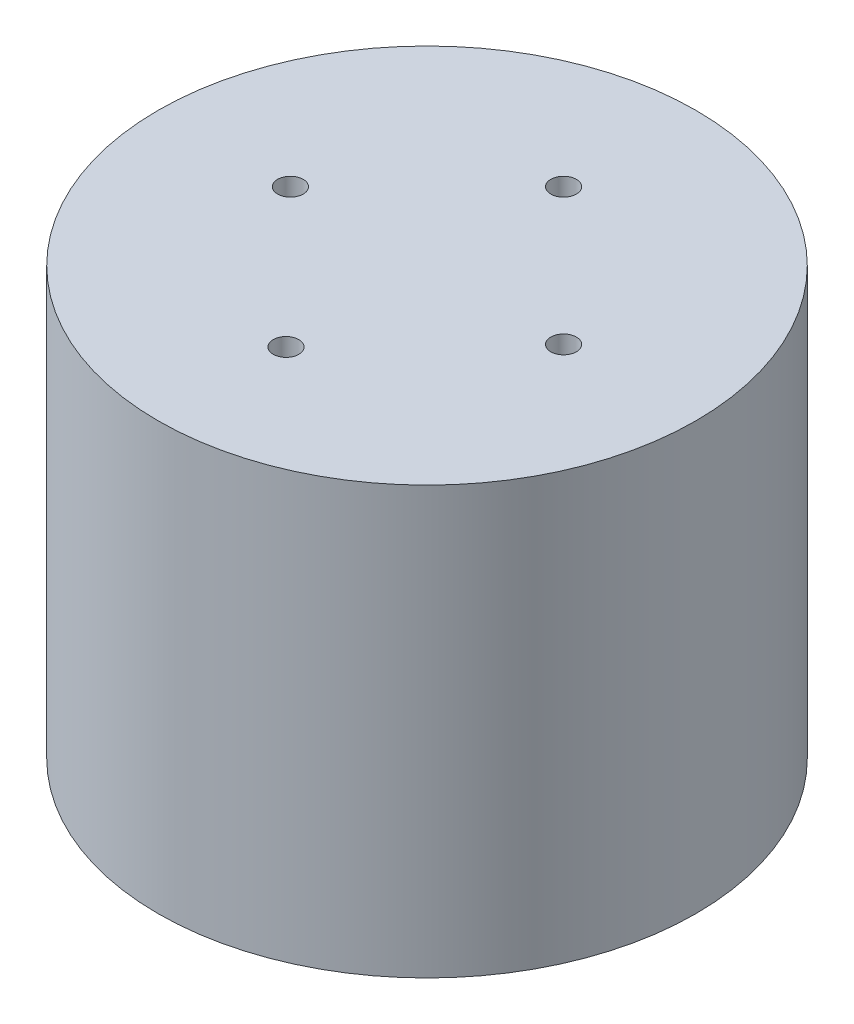
ISO-10303-21;
HEADER;
FILE_DESCRIPTION(('STEP AP214'),'2;1');
FILE_NAME('part.step','',(''),(''),'','','');
FILE_SCHEMA(('AUTOMOTIVE_DESIGN { 1 0 10303 214 1 1 1 1 }'));
ENDSEC;
DATA;
#1=APPLICATION_CONTEXT('core data for automotive mechanical design processes');
#2=APPLICATION_PROTOCOL_DEFINITION('international standard','automotive_design',2000,#1);
#3=PRODUCT_CONTEXT('',#1,'mechanical');
#4=PRODUCT('Part','Part','',(#3));
#5=PRODUCT_RELATED_PRODUCT_CATEGORY('part','',(#4));
#6=PRODUCT_DEFINITION_FORMATION('','',#4);
#7=PRODUCT_DEFINITION_CONTEXT('part definition',#1,'design');
#8=PRODUCT_DEFINITION('design','',#6,#7);
#9=PRODUCT_DEFINITION_SHAPE('','',#8);
#10=(LENGTH_UNIT() NAMED_UNIT(*) SI_UNIT(.MILLI.,.METRE.));
#11=(NAMED_UNIT(*) PLANE_ANGLE_UNIT() SI_UNIT($,.RADIAN.));
#12=(NAMED_UNIT(*) SI_UNIT($,.STERADIAN.) SOLID_ANGLE_UNIT());
#13=UNCERTAINTY_MEASURE_WITH_UNIT(LENGTH_MEASURE(1.E-05),#10,'distance_accuracy_value','');
#14=(GEOMETRIC_REPRESENTATION_CONTEXT(3) GLOBAL_UNCERTAINTY_ASSIGNED_CONTEXT((#13)) GLOBAL_UNIT_ASSIGNED_CONTEXT((#10,
#11,#12)) REPRESENTATION_CONTEXT('',''));
#15=CARTESIAN_POINT('',(0.,0.,0.));
#16=DIRECTION('',(0.,0.,1.));
#17=DIRECTION('',(1.,0.,0.));
#18=AXIS2_PLACEMENT_3D('',#15,#16,#17);
#19=CARTESIAN_POINT('',(0.,50.,0.));
#20=DIRECTION('',(0.,-1.,0.));
#21=DIRECTION('',(0.,0.,-1.));
#22=AXIS2_PLACEMENT_3D('',#19,#20,#21);
#23=CYLINDRICAL_SURFACE('',#22,31.5);
#24=CARTESIAN_POINT('',(0.,50.,0.));
#25=DIRECTION('',(0.,1.,0.));
#26=DIRECTION('',(0.,0.,1.));
#27=AXIS2_PLACEMENT_3D('',#24,#25,#26);
#28=CIRCLE('',#27,31.5);
#29=CARTESIAN_POINT('',(0.,50.,31.5));
#30=VERTEX_POINT('',#29);
#31=EDGE_CURVE('E10',#30,#30,#28,.T.);
#32=ORIENTED_EDGE('',*,*,#31,.F.);
#33=EDGE_LOOP('',(#32));
#34=FACE_BOUND('',#33,.T.);
#35=CARTESIAN_POINT('',(0.,0.,0.));
#36=DIRECTION('',(0.,1.,0.));
#37=DIRECTION('',(0.,0.,1.));
#38=AXIS2_PLACEMENT_3D('',#35,#36,#37);
#39=CIRCLE('',#38,31.5);
#40=CARTESIAN_POINT('',(0.,0.,31.5));
#41=VERTEX_POINT('',#40);
#42=EDGE_CURVE('E42',#41,#41,#39,.T.);
#43=ORIENTED_EDGE('',*,*,#42,.T.);
#44=EDGE_LOOP('',(#43));
#45=FACE_BOUND('',#44,.T.);
#46=ADVANCED_FACE('F35',(#34,#45),#23,.T.);
#47=CARTESIAN_POINT('',(0.,50.,0.));
#48=DIRECTION('',(0.,1.,0.));
#49=DIRECTION('',(0.,0.,1.));
#50=AXIS2_PLACEMENT_3D('',#47,#48,#49);
#51=PLANE('',#50);
#52=CARTESIAN_POINT('',(0.,50.,-16.));
#53=DIRECTION('',(0.,1.,0.));
#54=DIRECTION('',(0.,0.,1.));
#55=AXIS2_PLACEMENT_3D('',#52,#53,#54);
#56=CIRCLE('',#55,1.5);
#57=CARTESIAN_POINT('',(0.,50.,-14.5));
#58=VERTEX_POINT('',#57);
#59=EDGE_CURVE('E61',#58,#58,#56,.T.);
#60=ORIENTED_EDGE('',*,*,#59,.F.);
#61=EDGE_LOOP('',(#60));
#62=FACE_BOUND('',#61,.T.);
#63=CARTESIAN_POINT('',(16.,50.,0.));
#64=DIRECTION('',(0.,1.,0.));
#65=DIRECTION('',(0.,0.,1.));
#66=AXIS2_PLACEMENT_3D('',#63,#64,#65);
#67=CIRCLE('',#66,1.5);
#68=CARTESIAN_POINT('',(16.,50.,1.5));
#69=VERTEX_POINT('',#68);
#70=EDGE_CURVE('E152',#69,#69,#67,.T.);
#71=ORIENTED_EDGE('',*,*,#70,.F.);
#72=EDGE_LOOP('',(#71));
#73=FACE_BOUND('',#72,.T.);
#74=CARTESIAN_POINT('',(0.,50.,16.513466974242));
#75=DIRECTION('',(0.,1.,0.));
#76=DIRECTION('',(0.,0.,1.));
#77=AXIS2_PLACEMENT_3D('',#74,#75,#76);
#78=CIRCLE('',#77,1.5);
#79=CARTESIAN_POINT('',(0.,50.,18.013466974242));
#80=VERTEX_POINT('',#79);
#81=EDGE_CURVE('E74',#80,#80,#78,.T.);
#82=ORIENTED_EDGE('',*,*,#81,.F.);
#83=EDGE_LOOP('',(#82));
#84=FACE_BOUND('',#83,.T.);
#85=CARTESIAN_POINT('',(-16.,50.,0.));
#86=DIRECTION('',(0.,1.,0.));
#87=DIRECTION('',(0.,0.,1.));
#88=AXIS2_PLACEMENT_3D('',#85,#86,#87);
#89=CIRCLE('',#88,1.5);
#90=CARTESIAN_POINT('',(-16.,50.,1.5));
#91=VERTEX_POINT('',#90);
#92=EDGE_CURVE('E57',#91,#91,#89,.T.);
#93=ORIENTED_EDGE('',*,*,#92,.F.);
#94=EDGE_LOOP('',(#93));
#95=FACE_BOUND('',#94,.T.);
#96=ORIENTED_EDGE('',*,*,#31,.T.);
#97=EDGE_LOOP('',(#96));
#98=FACE_BOUND('',#97,.T.);
#99=ADVANCED_FACE('F97',(#62,#73,#84,#95,#98),#51,.T.);
#100=CARTESIAN_POINT('',(0.,0.,0.));
#101=DIRECTION('',(0.,1.,0.));
#102=DIRECTION('',(0.,0.,1.));
#103=AXIS2_PLACEMENT_3D('',#100,#101,#102);
#104=PLANE('',#103);
#105=CARTESIAN_POINT('',(0.,0.,0.));
#106=DIRECTION('',(0.,-1.,0.));
#107=DIRECTION('',(0.,0.,-1.));
#108=AXIS2_PLACEMENT_3D('',#105,#106,#107);
#109=CIRCLE('',#108,26.);
#110=CARTESIAN_POINT('',(0.,0.,-26.));
#111=VERTEX_POINT('',#110);
#112=EDGE_CURVE('E50',#111,#111,#109,.T.);
#113=ORIENTED_EDGE('',*,*,#112,.F.);
#114=EDGE_LOOP('',(#113));
#115=FACE_BOUND('',#114,.T.);
#116=ORIENTED_EDGE('',*,*,#42,.F.);
#117=EDGE_LOOP('',(#116));
#118=FACE_BOUND('',#117,.T.);
#119=ADVANCED_FACE('F94',(#115,#118),#104,.F.);
#120=CARTESIAN_POINT('',(0.,20.,0.));
#121=DIRECTION('',(0.,-1.,0.));
#122=DIRECTION('',(0.,0.,-1.));
#123=AXIS2_PLACEMENT_3D('',#120,#121,#122);
#124=CYLINDRICAL_SURFACE('',#123,26.);
#125=CARTESIAN_POINT('',(0.,20.,0.));
#126=DIRECTION('',(0.,-1.,0.));
#127=DIRECTION('',(0.,0.,-1.));
#128=AXIS2_PLACEMENT_3D('',#125,#126,#127);
#129=CIRCLE('',#128,26.);
#130=CARTESIAN_POINT('',(0.,20.,-26.));
#131=VERTEX_POINT('',#130);
#132=EDGE_CURVE('E47',#131,#131,#129,.T.);
#133=ORIENTED_EDGE('',*,*,#132,.F.);
#134=EDGE_LOOP('',(#133));
#135=FACE_BOUND('',#134,.T.);
#136=ORIENTED_EDGE('',*,*,#112,.T.);
#137=EDGE_LOOP('',(#136));
#138=FACE_BOUND('',#137,.T.);
#139=ADVANCED_FACE('F92',(#135,#138),#124,.F.);
#140=CARTESIAN_POINT('',(0.,20.,0.));
#141=DIRECTION('',(0.,-1.,0.));
#142=DIRECTION('',(0.,0.,-1.));
#143=AXIS2_PLACEMENT_3D('',#140,#141,#142);
#144=PLANE('',#143);
#145=CARTESIAN_POINT('',(0.,20.,-16.));
#146=DIRECTION('',(0.,-1.,0.));
#147=DIRECTION('',(0.,0.,-1.));
#148=AXIS2_PLACEMENT_3D('',#145,#146,#147);
#149=CIRCLE('',#148,1.5);
#150=CARTESIAN_POINT('',(0.,20.,-17.5));
#151=VERTEX_POINT('',#150);
#152=EDGE_CURVE('E38',#151,#151,#149,.T.);
#153=ORIENTED_EDGE('',*,*,#152,.F.);
#154=EDGE_LOOP('',(#153));
#155=FACE_BOUND('',#154,.T.);
#156=CARTESIAN_POINT('',(16.,20.,0.));
#157=DIRECTION('',(0.,-1.,0.));
#158=DIRECTION('',(0.,0.,-1.));
#159=AXIS2_PLACEMENT_3D('',#156,#157,#158);
#160=CIRCLE('',#159,1.5);
#161=CARTESIAN_POINT('',(16.,20.,-1.5));
#162=VERTEX_POINT('',#161);
#163=EDGE_CURVE('E60',#162,#162,#160,.T.);
#164=ORIENTED_EDGE('',*,*,#163,.F.);
#165=EDGE_LOOP('',(#164));
#166=FACE_BOUND('',#165,.T.);
#167=CARTESIAN_POINT('',(0.,20.,16.513466974242));
#168=DIRECTION('',(0.,-1.,0.));
#169=DIRECTION('',(0.,0.,-1.));
#170=AXIS2_PLACEMENT_3D('',#167,#168,#169);
#171=CIRCLE('',#170,1.5);
#172=CARTESIAN_POINT('',(0.,20.,15.013466974242));
#173=VERTEX_POINT('',#172);
#174=EDGE_CURVE('E58',#173,#173,#171,.T.);
#175=ORIENTED_EDGE('',*,*,#174,.F.);
#176=EDGE_LOOP('',(#175));
#177=FACE_BOUND('',#176,.T.);
#178=CARTESIAN_POINT('',(-16.,20.,0.));
#179=DIRECTION('',(0.,-1.,0.));
#180=DIRECTION('',(0.,0.,-1.));
#181=AXIS2_PLACEMENT_3D('',#178,#179,#180);
#182=CIRCLE('',#181,1.5);
#183=CARTESIAN_POINT('',(-16.,20.,-1.5));
#184=VERTEX_POINT('',#183);
#185=EDGE_CURVE('E53',#184,#184,#182,.T.);
#186=ORIENTED_EDGE('',*,*,#185,.F.);
#187=EDGE_LOOP('',(#186));
#188=FACE_BOUND('',#187,.T.);
#189=CARTESIAN_POINT('',(0.,20.,0.));
#190=DIRECTION('',(0.,-1.,0.));
#191=DIRECTION('',(0.,0.,-1.));
#192=AXIS2_PLACEMENT_3D('',#189,#190,#191);
#193=CIRCLE('',#192,11.);
#194=CARTESIAN_POINT('',(0.,20.,-11.));
#195=VERTEX_POINT('',#194);
#196=EDGE_CURVE('E79',#195,#195,#193,.T.);
#197=ORIENTED_EDGE('',*,*,#196,.F.);
#198=EDGE_LOOP('',(#197));
#199=FACE_BOUND('',#198,.T.);
#200=ORIENTED_EDGE('',*,*,#132,.T.);
#201=EDGE_LOOP('',(#200));
#202=FACE_BOUND('',#201,.T.);
#203=ADVANCED_FACE('F114',(#155,#166,#177,#188,#199,#202),#144,.T.);
#204=CARTESIAN_POINT('',(0.,27.5,0.));
#205=DIRECTION('',(0.,-1.,0.));
#206=DIRECTION('',(0.,0.,-1.));
#207=AXIS2_PLACEMENT_3D('',#204,#205,#206);
#208=CYLINDRICAL_SURFACE('',#207,11.);
#209=CARTESIAN_POINT('',(0.,27.5,0.));
#210=DIRECTION('',(0.,-1.,0.));
#211=DIRECTION('',(0.,0.,-1.));
#212=AXIS2_PLACEMENT_3D('',#209,#210,#211);
#213=CIRCLE('',#212,11.);
#214=CARTESIAN_POINT('',(0.,27.5,-11.));
#215=VERTEX_POINT('',#214);
#216=EDGE_CURVE('E82',#215,#215,#213,.T.);
#217=ORIENTED_EDGE('',*,*,#216,.F.);
#218=EDGE_LOOP('',(#217));
#219=FACE_BOUND('',#218,.T.);
#220=ORIENTED_EDGE('',*,*,#196,.T.);
#221=EDGE_LOOP('',(#220));
#222=FACE_BOUND('',#221,.T.);
#223=ADVANCED_FACE('F118',(#219,#222),#208,.F.);
#224=CARTESIAN_POINT('',(0.,27.5,0.));
#225=DIRECTION('',(0.,-1.,0.));
#226=DIRECTION('',(0.,0.,-1.));
#227=AXIS2_PLACEMENT_3D('',#224,#225,#226);
#228=PLANE('',#227);
#229=CARTESIAN_POINT('',(0.,27.5,0.));
#230=DIRECTION('',(0.,-1.,0.));
#231=DIRECTION('',(0.,0.,-1.));
#232=AXIS2_PLACEMENT_3D('',#229,#230,#231);
#233=CIRCLE('',#232,3.25);
#234=CARTESIAN_POINT('',(0.,27.5,-3.25));
#235=VERTEX_POINT('',#234);
#236=EDGE_CURVE('E56',#235,#235,#233,.T.);
#237=ORIENTED_EDGE('',*,*,#236,.F.);
#238=EDGE_LOOP('',(#237));
#239=FACE_BOUND('',#238,.T.);
#240=ORIENTED_EDGE('',*,*,#216,.T.);
#241=EDGE_LOOP('',(#240));
#242=FACE_BOUND('',#241,.T.);
#243=ADVANCED_FACE('F122',(#239,#242),#228,.T.);
#244=CARTESIAN_POINT('',(0.,41.,0.));
#245=DIRECTION('',(0.,-1.,0.));
#246=DIRECTION('',(0.,0.,-1.));
#247=AXIS2_PLACEMENT_3D('',#244,#245,#246);
#248=CYLINDRICAL_SURFACE('',#247,3.25);
#249=CARTESIAN_POINT('',(0.,41.,0.));
#250=DIRECTION('',(0.,-1.,0.));
#251=DIRECTION('',(0.,0.,-1.));
#252=AXIS2_PLACEMENT_3D('',#249,#250,#251);
#253=CIRCLE('',#252,3.25);
#254=CARTESIAN_POINT('',(0.,41.,-3.25));
#255=VERTEX_POINT('',#254);
#256=EDGE_CURVE('E76',#255,#255,#253,.T.);
#257=ORIENTED_EDGE('',*,*,#256,.F.);
#258=EDGE_LOOP('',(#257));
#259=FACE_BOUND('',#258,.T.);
#260=ORIENTED_EDGE('',*,*,#236,.T.);
#261=EDGE_LOOP('',(#260));
#262=FACE_BOUND('',#261,.T.);
#263=ADVANCED_FACE('F126',(#259,#262),#248,.F.);
#264=CARTESIAN_POINT('',(0.,41.,0.));
#265=DIRECTION('',(0.,-1.,0.));
#266=DIRECTION('',(0.,0.,-1.));
#267=AXIS2_PLACEMENT_3D('',#264,#265,#266);
#268=PLANE('',#267);
#269=ORIENTED_EDGE('',*,*,#256,.T.);
#270=EDGE_LOOP('',(#269));
#271=FACE_BOUND('',#270,.T.);
#272=ADVANCED_FACE('F130',(#271),#268,.T.);
#273=CARTESIAN_POINT('',(-16.,0.,0.));
#274=DIRECTION('',(0.,1.,0.));
#275=DIRECTION('',(0.,0.,1.));
#276=AXIS2_PLACEMENT_3D('',#273,#274,#275);
#277=CYLINDRICAL_SURFACE('',#276,1.5);
#278=ORIENTED_EDGE('',*,*,#185,.T.);
#279=EDGE_LOOP('',(#278));
#280=FACE_BOUND('',#279,.T.);
#281=ORIENTED_EDGE('',*,*,#92,.T.);
#282=EDGE_LOOP('',(#281));
#283=FACE_BOUND('',#282,.T.);
#284=ADVANCED_FACE('F134',(#280,#283),#277,.F.);
#285=CARTESIAN_POINT('',(0.,0.,16.513466974242));
#286=DIRECTION('',(0.,1.,0.));
#287=DIRECTION('',(0.,0.,1.));
#288=AXIS2_PLACEMENT_3D('',#285,#286,#287);
#289=CYLINDRICAL_SURFACE('',#288,1.5);
#290=ORIENTED_EDGE('',*,*,#174,.T.);
#291=EDGE_LOOP('',(#290));
#292=FACE_BOUND('',#291,.T.);
#293=ORIENTED_EDGE('',*,*,#81,.T.);
#294=EDGE_LOOP('',(#293));
#295=FACE_BOUND('',#294,.T.);
#296=ADVANCED_FACE('F138',(#292,#295),#289,.F.);
#297=CARTESIAN_POINT('',(16.,0.,0.));
#298=DIRECTION('',(0.,1.,0.));
#299=DIRECTION('',(0.,0.,1.));
#300=AXIS2_PLACEMENT_3D('',#297,#298,#299);
#301=CYLINDRICAL_SURFACE('',#300,1.5);
#302=ORIENTED_EDGE('',*,*,#163,.T.);
#303=EDGE_LOOP('',(#302));
#304=FACE_BOUND('',#303,.T.);
#305=ORIENTED_EDGE('',*,*,#70,.T.);
#306=EDGE_LOOP('',(#305));
#307=FACE_BOUND('',#306,.T.);
#308=ADVANCED_FACE('F142',(#304,#307),#301,.F.);
#309=CARTESIAN_POINT('',(0.,0.,-16.));
#310=DIRECTION('',(0.,1.,0.));
#311=DIRECTION('',(0.,0.,1.));
#312=AXIS2_PLACEMENT_3D('',#309,#310,#311);
#313=CYLINDRICAL_SURFACE('',#312,1.5);
#314=ORIENTED_EDGE('',*,*,#152,.T.);
#315=EDGE_LOOP('',(#314));
#316=FACE_BOUND('',#315,.T.);
#317=ORIENTED_EDGE('',*,*,#59,.T.);
#318=EDGE_LOOP('',(#317));
#319=FACE_BOUND('',#318,.T.);
#320=ADVANCED_FACE('F146',(#316,#319),#313,.F.);
#321=CLOSED_SHELL('',(#46,#99,#119,#139,#203,#223,#243,#263,#272,#284,#296,#308,#320));
#322=MANIFOLD_SOLID_BREP('B2',#321);
#323=ADVANCED_BREP_SHAPE_REPRESENTATION('',(#18,#322),#14);
#324=SHAPE_DEFINITION_REPRESENTATION(#9,#323);
ENDSEC;
END-ISO-10303-21;
